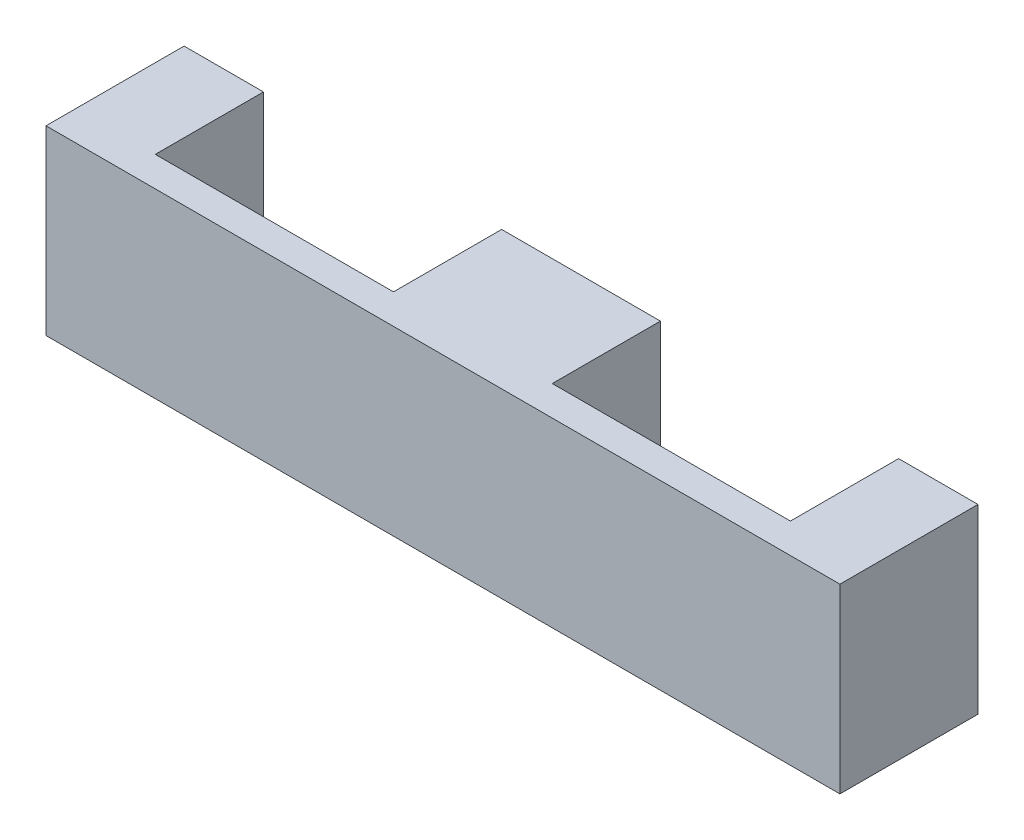
ISO-10303-21;
HEADER;
FILE_DESCRIPTION(('STEP AP214'),'2;1');
FILE_NAME('part.step','',(''),(''),'','','');
FILE_SCHEMA(('AUTOMOTIVE_DESIGN { 1 0 10303 214 1 1 1 1 }'));
ENDSEC;
DATA;
#1=APPLICATION_CONTEXT('core data for automotive mechanical design processes');
#2=APPLICATION_PROTOCOL_DEFINITION('international standard','automotive_design',2000,#1);
#3=PRODUCT_CONTEXT('',#1,'mechanical');
#4=PRODUCT('Part','Part','',(#3));
#5=PRODUCT_RELATED_PRODUCT_CATEGORY('part','',(#4));
#6=PRODUCT_DEFINITION_FORMATION('','',#4);
#7=PRODUCT_DEFINITION_CONTEXT('part definition',#1,'design');
#8=PRODUCT_DEFINITION('design','',#6,#7);
#9=PRODUCT_DEFINITION_SHAPE('','',#8);
#10=(LENGTH_UNIT() NAMED_UNIT(*) SI_UNIT(.MILLI.,.METRE.));
#11=(NAMED_UNIT(*) PLANE_ANGLE_UNIT() SI_UNIT($,.RADIAN.));
#12=(NAMED_UNIT(*) SI_UNIT($,.STERADIAN.) SOLID_ANGLE_UNIT());
#13=UNCERTAINTY_MEASURE_WITH_UNIT(LENGTH_MEASURE(1.E-05),#10,'distance_accuracy_value','');
#14=(GEOMETRIC_REPRESENTATION_CONTEXT(3) GLOBAL_UNCERTAINTY_ASSIGNED_CONTEXT((#13)) GLOBAL_UNIT_ASSIGNED_CONTEXT((#10,
#11,#12)) REPRESENTATION_CONTEXT('',''));
#15=CARTESIAN_POINT('',(0.,0.,0.));
#16=DIRECTION('',(0.,0.,1.));
#17=DIRECTION('',(1.,0.,0.));
#18=AXIS2_PLACEMENT_3D('',#15,#16,#17);
#19=CARTESIAN_POINT('',(-10.999999975,10.447368421053,5.9));
#20=DIRECTION('',(0.,1.,0.));
#21=DIRECTION('',(1.,0.,0.));
#22=AXIS2_PLACEMENT_3D('',#19,#20,#21);
#23=PLANE('',#22);
#24=DIRECTION('',(1.,0.,0.));
#25=VECTOR('',#24,1.);
#26=CARTESIAN_POINT('',(-10.999999975,10.447368421053,5.9));
#27=LINE('',#26,#25);
#28=CARTESIAN_POINT('',(-10.999999975,10.447368421053,5.9));
#29=VERTEX_POINT('',#28);
#30=CARTESIAN_POINT('',(-7.54999998,10.447368421053,5.9));
#31=VERTEX_POINT('',#30);
#32=EDGE_CURVE('E11',#29,#31,#27,.T.);
#33=ORIENTED_EDGE('',*,*,#32,.F.);
#34=DIRECTION('',(0.,0.,1.));
#35=VECTOR('',#34,1.);
#36=CARTESIAN_POINT('',(-10.999999975,10.447368421053,5.9));
#37=LINE('',#36,#35);
#38=CARTESIAN_POINT('',(-10.999999975,10.447368421053,11.9));
#39=VERTEX_POINT('',#38);
#40=EDGE_CURVE('E24',#29,#39,#37,.T.);
#41=ORIENTED_EDGE('',*,*,#40,.T.);
#42=DIRECTION('',(1.,0.,0.));
#43=VECTOR('',#42,1.);
#44=CARTESIAN_POINT('',(-10.999999975,10.447368421053,11.9));
#45=LINE('',#44,#43);
#46=CARTESIAN_POINT('',(23.499999975,10.447368421053,11.9));
#47=VERTEX_POINT('',#46);
#48=EDGE_CURVE('E118',#39,#47,#45,.T.);
#49=ORIENTED_EDGE('',*,*,#48,.T.);
#50=DIRECTION('',(0.,0.,1.));
#51=VECTOR('',#50,1.);
#52=CARTESIAN_POINT('',(23.499999975,10.447368421053,5.9));
#53=LINE('',#52,#51);
#54=CARTESIAN_POINT('',(23.499999975,10.447368421053,5.9));
#55=VERTEX_POINT('',#54);
#56=EDGE_CURVE('E196',#55,#47,#53,.T.);
#57=ORIENTED_EDGE('',*,*,#56,.F.);
#58=DIRECTION('',(1.,0.,0.));
#59=VECTOR('',#58,1.);
#60=CARTESIAN_POINT('',(-10.999999975,10.447368421053,5.9));
#61=LINE('',#60,#59);
#62=CARTESIAN_POINT('',(20.04999998,10.447368421053,5.9));
#63=VERTEX_POINT('',#62);
#64=EDGE_CURVE('E193',#63,#55,#61,.T.);
#65=ORIENTED_EDGE('',*,*,#64,.F.);
#66=DIRECTION('',(0.,0.,1.));
#67=VECTOR('',#66,1.);
#68=CARTESIAN_POINT('',(20.04999998,10.447368421053,5.9));
#69=LINE('',#68,#67);
#70=CARTESIAN_POINT('',(20.04999998,10.447368421053,10.6));
#71=VERTEX_POINT('',#70);
#72=EDGE_CURVE('E191',#63,#71,#69,.T.);
#73=ORIENTED_EDGE('',*,*,#72,.T.);
#74=DIRECTION('',(-1.,0.,0.));
#75=VECTOR('',#74,1.);
#76=CARTESIAN_POINT('',(20.04999998,10.447368421053,10.6));
#77=LINE('',#76,#75);
#78=CARTESIAN_POINT('',(9.699999995,10.447368421053,10.6));
#79=VERTEX_POINT('',#78);
#80=EDGE_CURVE('E189',#71,#79,#77,.T.);
#81=ORIENTED_EDGE('',*,*,#80,.T.);
#82=DIRECTION('',(0.,0.,1.));
#83=VECTOR('',#82,1.);
#84=CARTESIAN_POINT('',(9.699999995,10.447368421053,5.9));
#85=LINE('',#84,#83);
#86=CARTESIAN_POINT('',(9.699999995,10.447368421053,5.9));
#87=VERTEX_POINT('',#86);
#88=EDGE_CURVE('E186',#87,#79,#85,.T.);
#89=ORIENTED_EDGE('',*,*,#88,.F.);
#90=DIRECTION('',(1.,0.,0.));
#91=VECTOR('',#90,1.);
#92=CARTESIAN_POINT('',(-10.999999975,10.447368421053,5.9));
#93=LINE('',#92,#91);
#94=CARTESIAN_POINT('',(2.800000005,10.447368421053,5.9));
#95=VERTEX_POINT('',#94);
#96=EDGE_CURVE('E183',#95,#87,#93,.T.);
#97=ORIENTED_EDGE('',*,*,#96,.F.);
#98=DIRECTION('',(0.,0.,1.));
#99=VECTOR('',#98,1.);
#100=CARTESIAN_POINT('',(2.800000005,10.447368421053,5.9));
#101=LINE('',#100,#99);
#102=CARTESIAN_POINT('',(2.800000005,10.447368421053,10.6));
#103=VERTEX_POINT('',#102);
#104=EDGE_CURVE('E181',#95,#103,#101,.T.);
#105=ORIENTED_EDGE('',*,*,#104,.T.);
#106=DIRECTION('',(-1.,0.,0.));
#107=VECTOR('',#106,1.);
#108=CARTESIAN_POINT('',(2.800000005,10.447368421053,10.6));
#109=LINE('',#108,#107);
#110=CARTESIAN_POINT('',(-7.54999998,10.447368421053,10.6));
#111=VERTEX_POINT('',#110);
#112=EDGE_CURVE('E179',#103,#111,#109,.T.);
#113=ORIENTED_EDGE('',*,*,#112,.T.);
#114=DIRECTION('',(0.,0.,1.));
#115=VECTOR('',#114,1.);
#116=CARTESIAN_POINT('',(-7.54999998,10.447368421053,5.9));
#117=LINE('',#116,#115);
#118=EDGE_CURVE('E176',#31,#111,#117,.T.);
#119=ORIENTED_EDGE('',*,*,#118,.F.);
#120=EDGE_LOOP('',(#33,#41,#49,#57,#65,#73,#81,#89,#97,#105,#113,#119));
#121=FACE_BOUND('',#120,.T.);
#122=ADVANCED_FACE('F17',(#121),#23,.T.);
#123=CARTESIAN_POINT('',(6.25,6.5,5.9));
#124=DIRECTION('',(0.,0.,-1.));
#125=DIRECTION('',(-1.,0.,0.));
#126=AXIS2_PLACEMENT_3D('',#123,#124,#125);
#127=PLANE('',#126);
#128=DIRECTION('',(0.,1.,0.));
#129=VECTOR('',#128,1.);
#130=CARTESIAN_POINT('',(-10.999999975,2.552631578947,5.9));
#131=LINE('',#130,#129);
#132=CARTESIAN_POINT('',(-10.999999975,2.552631578947,5.9));
#133=VERTEX_POINT('',#132);
#134=EDGE_CURVE('E122',#133,#29,#131,.T.);
#135=ORIENTED_EDGE('',*,*,#134,.T.);
#136=ORIENTED_EDGE('',*,*,#32,.T.);
#137=DIRECTION('',(0.,-1.,0.));
#138=VECTOR('',#137,1.);
#139=CARTESIAN_POINT('',(-7.54999998,10.447368421053,5.9));
#140=LINE('',#139,#138);
#141=CARTESIAN_POINT('',(-7.54999998,2.552631578947,5.9));
#142=VERTEX_POINT('',#141);
#143=EDGE_CURVE('E173',#31,#142,#140,.T.);
#144=ORIENTED_EDGE('',*,*,#143,.T.);
#145=DIRECTION('',(-1.,0.,0.));
#146=VECTOR('',#145,1.);
#147=CARTESIAN_POINT('',(23.499999975,2.552631578947,5.9));
#148=LINE('',#147,#146);
#149=EDGE_CURVE('E171',#142,#133,#148,.T.);
#150=ORIENTED_EDGE('',*,*,#149,.T.);
#151=EDGE_LOOP('',(#135,#136,#144,#150));
#152=FACE_BOUND('',#151,.T.);
#153=ADVANCED_FACE('F199',(#152),#127,.T.);
#154=CARTESIAN_POINT('',(-7.54999998,10.447368421053,5.9));
#155=DIRECTION('',(1.,0.,0.));
#156=DIRECTION('',(0.,-1.,0.));
#157=AXIS2_PLACEMENT_3D('',#154,#155,#156);
#158=PLANE('',#157);
#159=ORIENTED_EDGE('',*,*,#118,.T.);
#160=DIRECTION('',(0.,-1.,0.));
#161=VECTOR('',#160,1.);
#162=CARTESIAN_POINT('',(-7.54999998,10.447368421053,10.6));
#163=LINE('',#162,#161);
#164=CARTESIAN_POINT('',(-7.54999998,2.552631578947,10.6));
#165=VERTEX_POINT('',#164);
#166=EDGE_CURVE('E169',#111,#165,#163,.T.);
#167=ORIENTED_EDGE('',*,*,#166,.T.);
#168=DIRECTION('',(0.,0.,1.));
#169=VECTOR('',#168,1.);
#170=CARTESIAN_POINT('',(-7.54999998,2.552631578947,5.9));
#171=LINE('',#170,#169);
#172=EDGE_CURVE('E166',#142,#165,#171,.T.);
#173=ORIENTED_EDGE('',*,*,#172,.F.);
#174=ORIENTED_EDGE('',*,*,#143,.F.);
#175=EDGE_LOOP('',(#159,#167,#173,#174));
#176=FACE_BOUND('',#175,.T.);
#177=ADVANCED_FACE('F204',(#176),#158,.T.);
#178=CARTESIAN_POINT('',(-2.3749999875,6.5,10.6));
#179=DIRECTION('',(0.,0.,1.));
#180=DIRECTION('',(1.,0.,0.));
#181=AXIS2_PLACEMENT_3D('',#178,#179,#180);
#182=PLANE('',#181);
#183=ORIENTED_EDGE('',*,*,#166,.F.);
#184=ORIENTED_EDGE('',*,*,#112,.F.);
#185=DIRECTION('',(0.,1.,0.));
#186=VECTOR('',#185,1.);
#187=CARTESIAN_POINT('',(2.800000005,2.552631578947,10.6));
#188=LINE('',#187,#186);
#189=CARTESIAN_POINT('',(2.800000005,2.552631578947,10.6));
#190=VERTEX_POINT('',#189);
#191=EDGE_CURVE('E163',#190,#103,#188,.T.);
#192=ORIENTED_EDGE('',*,*,#191,.F.);
#193=DIRECTION('',(1.,0.,0.));
#194=VECTOR('',#193,1.);
#195=CARTESIAN_POINT('',(-7.54999998,2.552631578947,10.6));
#196=LINE('',#195,#194);
#197=EDGE_CURVE('E161',#165,#190,#196,.T.);
#198=ORIENTED_EDGE('',*,*,#197,.F.);
#199=EDGE_LOOP('',(#183,#184,#192,#198));
#200=FACE_BOUND('',#199,.T.);
#201=ADVANCED_FACE('F208',(#200),#182,.F.);
#202=CARTESIAN_POINT('',(2.800000005,2.552631578947,5.9));
#203=DIRECTION('',(-1.,0.,0.));
#204=DIRECTION('',(0.,1.,0.));
#205=AXIS2_PLACEMENT_3D('',#202,#203,#204);
#206=PLANE('',#205);
#207=DIRECTION('',(0.,0.,1.));
#208=VECTOR('',#207,1.);
#209=CARTESIAN_POINT('',(2.800000005,2.552631578947,5.9));
#210=LINE('',#209,#208);
#211=CARTESIAN_POINT('',(2.800000005,2.552631578947,5.9));
#212=VERTEX_POINT('',#211);
#213=EDGE_CURVE('E158',#212,#190,#210,.T.);
#214=ORIENTED_EDGE('',*,*,#213,.T.);
#215=ORIENTED_EDGE('',*,*,#191,.T.);
#216=ORIENTED_EDGE('',*,*,#104,.F.);
#217=DIRECTION('',(0.,1.,0.));
#218=VECTOR('',#217,1.);
#219=CARTESIAN_POINT('',(2.800000005,2.552631578947,5.9));
#220=LINE('',#219,#218);
#221=EDGE_CURVE('E155',#212,#95,#220,.T.);
#222=ORIENTED_EDGE('',*,*,#221,.F.);
#223=EDGE_LOOP('',(#214,#215,#216,#222));
#224=FACE_BOUND('',#223,.T.);
#225=ADVANCED_FACE('F215',(#224),#206,.T.);
#226=CARTESIAN_POINT('',(6.25,6.5,5.9));
#227=DIRECTION('',(0.,0.,-1.));
#228=DIRECTION('',(-1.,0.,0.));
#229=AXIS2_PLACEMENT_3D('',#226,#227,#228);
#230=PLANE('',#229);
#231=ORIENTED_EDGE('',*,*,#221,.T.);
#232=ORIENTED_EDGE('',*,*,#96,.T.);
#233=DIRECTION('',(0.,-1.,0.));
#234=VECTOR('',#233,1.);
#235=CARTESIAN_POINT('',(9.699999995,10.447368421053,5.9));
#236=LINE('',#235,#234);
#237=CARTESIAN_POINT('',(9.699999995,2.552631578947,5.9));
#238=VERTEX_POINT('',#237);
#239=EDGE_CURVE('E153',#87,#238,#236,.T.);
#240=ORIENTED_EDGE('',*,*,#239,.T.);
#241=DIRECTION('',(-1.,0.,0.));
#242=VECTOR('',#241,1.);
#243=CARTESIAN_POINT('',(23.499999975,2.552631578947,5.9));
#244=LINE('',#243,#242);
#245=EDGE_CURVE('E150',#238,#212,#244,.T.);
#246=ORIENTED_EDGE('',*,*,#245,.T.);
#247=EDGE_LOOP('',(#231,#232,#240,#246));
#248=FACE_BOUND('',#247,.T.);
#249=ADVANCED_FACE('F217',(#248),#230,.T.);
#250=CARTESIAN_POINT('',(9.699999995,10.447368421053,5.9));
#251=DIRECTION('',(1.,0.,0.));
#252=DIRECTION('',(0.,-1.,0.));
#253=AXIS2_PLACEMENT_3D('',#250,#251,#252);
#254=PLANE('',#253);
#255=ORIENTED_EDGE('',*,*,#88,.T.);
#256=DIRECTION('',(0.,-1.,0.));
#257=VECTOR('',#256,1.);
#258=CARTESIAN_POINT('',(9.699999995,10.447368421053,10.6));
#259=LINE('',#258,#257);
#260=CARTESIAN_POINT('',(9.699999995,2.552631578947,10.6));
#261=VERTEX_POINT('',#260);
#262=EDGE_CURVE('E148',#79,#261,#259,.T.);
#263=ORIENTED_EDGE('',*,*,#262,.T.);
#264=DIRECTION('',(0.,0.,1.));
#265=VECTOR('',#264,1.);
#266=CARTESIAN_POINT('',(9.699999995,2.552631578947,5.9));
#267=LINE('',#266,#265);
#268=EDGE_CURVE('E145',#238,#261,#267,.T.);
#269=ORIENTED_EDGE('',*,*,#268,.F.);
#270=ORIENTED_EDGE('',*,*,#239,.F.);
#271=EDGE_LOOP('',(#255,#263,#269,#270));
#272=FACE_BOUND('',#271,.T.);
#273=ADVANCED_FACE('F220',(#272),#254,.T.);
#274=CARTESIAN_POINT('',(14.8749999875,6.5,10.6));
#275=DIRECTION('',(0.,0.,1.));
#276=DIRECTION('',(1.,0.,0.));
#277=AXIS2_PLACEMENT_3D('',#274,#275,#276);
#278=PLANE('',#277);
#279=ORIENTED_EDGE('',*,*,#262,.F.);
#280=ORIENTED_EDGE('',*,*,#80,.F.);
#281=DIRECTION('',(0.,1.,0.));
#282=VECTOR('',#281,1.);
#283=CARTESIAN_POINT('',(20.04999998,2.552631578947,10.6));
#284=LINE('',#283,#282);
#285=CARTESIAN_POINT('',(20.04999998,2.552631578947,10.6));
#286=VERTEX_POINT('',#285);
#287=EDGE_CURVE('E142',#286,#71,#284,.T.);
#288=ORIENTED_EDGE('',*,*,#287,.F.);
#289=DIRECTION('',(1.,0.,0.));
#290=VECTOR('',#289,1.);
#291=CARTESIAN_POINT('',(9.699999995,2.552631578947,10.6));
#292=LINE('',#291,#290);
#293=EDGE_CURVE('E140',#261,#286,#292,.T.);
#294=ORIENTED_EDGE('',*,*,#293,.F.);
#295=EDGE_LOOP('',(#279,#280,#288,#294));
#296=FACE_BOUND('',#295,.T.);
#297=ADVANCED_FACE('F225',(#296),#278,.F.);
#298=CARTESIAN_POINT('',(20.04999998,2.552631578947,5.9));
#299=DIRECTION('',(-1.,0.,0.));
#300=DIRECTION('',(0.,1.,0.));
#301=AXIS2_PLACEMENT_3D('',#298,#299,#300);
#302=PLANE('',#301);
#303=DIRECTION('',(0.,0.,1.));
#304=VECTOR('',#303,1.);
#305=CARTESIAN_POINT('',(20.04999998,2.552631578947,5.9));
#306=LINE('',#305,#304);
#307=CARTESIAN_POINT('',(20.04999998,2.552631578947,5.9));
#308=VERTEX_POINT('',#307);
#309=EDGE_CURVE('E137',#308,#286,#306,.T.);
#310=ORIENTED_EDGE('',*,*,#309,.T.);
#311=ORIENTED_EDGE('',*,*,#287,.T.);
#312=ORIENTED_EDGE('',*,*,#72,.F.);
#313=DIRECTION('',(0.,1.,0.));
#314=VECTOR('',#313,1.);
#315=CARTESIAN_POINT('',(20.04999998,2.552631578947,5.9));
#316=LINE('',#315,#314);
#317=EDGE_CURVE('E134',#308,#63,#316,.T.);
#318=ORIENTED_EDGE('',*,*,#317,.F.);
#319=EDGE_LOOP('',(#310,#311,#312,#318));
#320=FACE_BOUND('',#319,.T.);
#321=ADVANCED_FACE('F230',(#320),#302,.T.);
#322=CARTESIAN_POINT('',(6.25,6.5,5.9));
#323=DIRECTION('',(0.,0.,-1.));
#324=DIRECTION('',(-1.,0.,0.));
#325=AXIS2_PLACEMENT_3D('',#322,#323,#324);
#326=PLANE('',#325);
#327=ORIENTED_EDGE('',*,*,#317,.T.);
#328=ORIENTED_EDGE('',*,*,#64,.T.);
#329=DIRECTION('',(0.,-1.,0.));
#330=VECTOR('',#329,1.);
#331=CARTESIAN_POINT('',(23.499999975,10.447368421053,5.9));
#332=LINE('',#331,#330);
#333=CARTESIAN_POINT('',(23.499999975,2.552631578947,5.9));
#334=VERTEX_POINT('',#333);
#335=EDGE_CURVE('E132',#55,#334,#332,.T.);
#336=ORIENTED_EDGE('',*,*,#335,.T.);
#337=DIRECTION('',(-1.,0.,0.));
#338=VECTOR('',#337,1.);
#339=CARTESIAN_POINT('',(23.499999975,2.552631578947,5.9));
#340=LINE('',#339,#338);
#341=EDGE_CURVE('E129',#334,#308,#340,.T.);
#342=ORIENTED_EDGE('',*,*,#341,.T.);
#343=EDGE_LOOP('',(#327,#328,#336,#342));
#344=FACE_BOUND('',#343,.T.);
#345=ADVANCED_FACE('F235',(#344),#326,.T.);
#346=CARTESIAN_POINT('',(23.499999975,10.447368421053,5.9));
#347=DIRECTION('',(1.,0.,0.));
#348=DIRECTION('',(0.,-1.,0.));
#349=AXIS2_PLACEMENT_3D('',#346,#347,#348);
#350=PLANE('',#349);
#351=ORIENTED_EDGE('',*,*,#56,.T.);
#352=DIRECTION('',(0.,-1.,0.));
#353=VECTOR('',#352,1.);
#354=CARTESIAN_POINT('',(23.499999975,10.447368421053,11.9));
#355=LINE('',#354,#353);
#356=CARTESIAN_POINT('',(23.499999975,2.552631578947,11.9));
#357=VERTEX_POINT('',#356);
#358=EDGE_CURVE('E127',#47,#357,#355,.T.);
#359=ORIENTED_EDGE('',*,*,#358,.T.);
#360=DIRECTION('',(0.,0.,1.));
#361=VECTOR('',#360,1.);
#362=CARTESIAN_POINT('',(23.499999975,2.552631578947,5.9));
#363=LINE('',#362,#361);
#364=EDGE_CURVE('E110',#334,#357,#363,.T.);
#365=ORIENTED_EDGE('',*,*,#364,.F.);
#366=ORIENTED_EDGE('',*,*,#335,.F.);
#367=EDGE_LOOP('',(#351,#359,#365,#366));
#368=FACE_BOUND('',#367,.T.);
#369=ADVANCED_FACE('F234',(#368),#350,.T.);
#370=CARTESIAN_POINT('',(6.25,6.5,11.9));
#371=DIRECTION('',(0.,0.,-1.));
#372=DIRECTION('',(-1.,0.,0.));
#373=AXIS2_PLACEMENT_3D('',#370,#371,#372);
#374=PLANE('',#373);
#375=DIRECTION('',(0.,1.,0.));
#376=VECTOR('',#375,1.);
#377=CARTESIAN_POINT('',(-10.999999975,2.552631578947,11.9));
#378=LINE('',#377,#376);
#379=CARTESIAN_POINT('',(-10.999999975,2.552631578947,11.9));
#380=VERTEX_POINT('',#379);
#381=EDGE_CURVE('E113',#380,#39,#378,.T.);
#382=ORIENTED_EDGE('',*,*,#381,.F.);
#383=DIRECTION('',(-1.,0.,0.));
#384=VECTOR('',#383,1.);
#385=CARTESIAN_POINT('',(23.499999975,2.552631578947,11.9));
#386=LINE('',#385,#384);
#387=EDGE_CURVE('E102',#357,#380,#386,.T.);
#388=ORIENTED_EDGE('',*,*,#387,.F.);
#389=ORIENTED_EDGE('',*,*,#358,.F.);
#390=ORIENTED_EDGE('',*,*,#48,.F.);
#391=EDGE_LOOP('',(#382,#388,#389,#390));
#392=FACE_BOUND('',#391,.T.);
#393=ADVANCED_FACE('F117',(#392),#374,.F.);
#394=CARTESIAN_POINT('',(-10.999999975,2.552631578947,5.9));
#395=DIRECTION('',(-1.,0.,0.));
#396=DIRECTION('',(0.,1.,0.));
#397=AXIS2_PLACEMENT_3D('',#394,#395,#396);
#398=PLANE('',#397);
#399=DIRECTION('',(0.,0.,1.));
#400=VECTOR('',#399,1.);
#401=CARTESIAN_POINT('',(-10.999999975,2.552631578947,5.9));
#402=LINE('',#401,#400);
#403=EDGE_CURVE('E108',#133,#380,#402,.T.);
#404=ORIENTED_EDGE('',*,*,#403,.T.);
#405=ORIENTED_EDGE('',*,*,#381,.T.);
#406=ORIENTED_EDGE('',*,*,#40,.F.);
#407=ORIENTED_EDGE('',*,*,#134,.F.);
#408=EDGE_LOOP('',(#404,#405,#406,#407));
#409=FACE_BOUND('',#408,.T.);
#410=ADVANCED_FACE('F121',(#409),#398,.T.);
#411=CARTESIAN_POINT('',(23.499999975,2.552631578947,5.9));
#412=DIRECTION('',(0.,-1.,0.));
#413=DIRECTION('',(-1.,0.,0.));
#414=AXIS2_PLACEMENT_3D('',#411,#412,#413);
#415=PLANE('',#414);
#416=ORIENTED_EDGE('',*,*,#341,.F.);
#417=ORIENTED_EDGE('',*,*,#364,.T.);
#418=ORIENTED_EDGE('',*,*,#387,.T.);
#419=ORIENTED_EDGE('',*,*,#403,.F.);
#420=ORIENTED_EDGE('',*,*,#149,.F.);
#421=ORIENTED_EDGE('',*,*,#172,.T.);
#422=ORIENTED_EDGE('',*,*,#197,.T.);
#423=ORIENTED_EDGE('',*,*,#213,.F.);
#424=ORIENTED_EDGE('',*,*,#245,.F.);
#425=ORIENTED_EDGE('',*,*,#268,.T.);
#426=ORIENTED_EDGE('',*,*,#293,.T.);
#427=ORIENTED_EDGE('',*,*,#309,.F.);
#428=EDGE_LOOP('',(#416,#417,#418,#419,#420,#421,#422,#423,#424,#425,#426,#427));
#429=FACE_BOUND('',#428,.T.);
#430=ADVANCED_FACE('F105',(#429),#415,.T.);
#431=CLOSED_SHELL('',(#122,#153,#177,#201,#225,#249,#273,#297,#321,#345,#369,#393,#410,#430));
#432=MANIFOLD_SOLID_BREP('B1',#431);
#433=ADVANCED_BREP_SHAPE_REPRESENTATION('',(#18,#432),#14);
#434=SHAPE_DEFINITION_REPRESENTATION(#9,#433);
ENDSEC;
END-ISO-10303-21;
